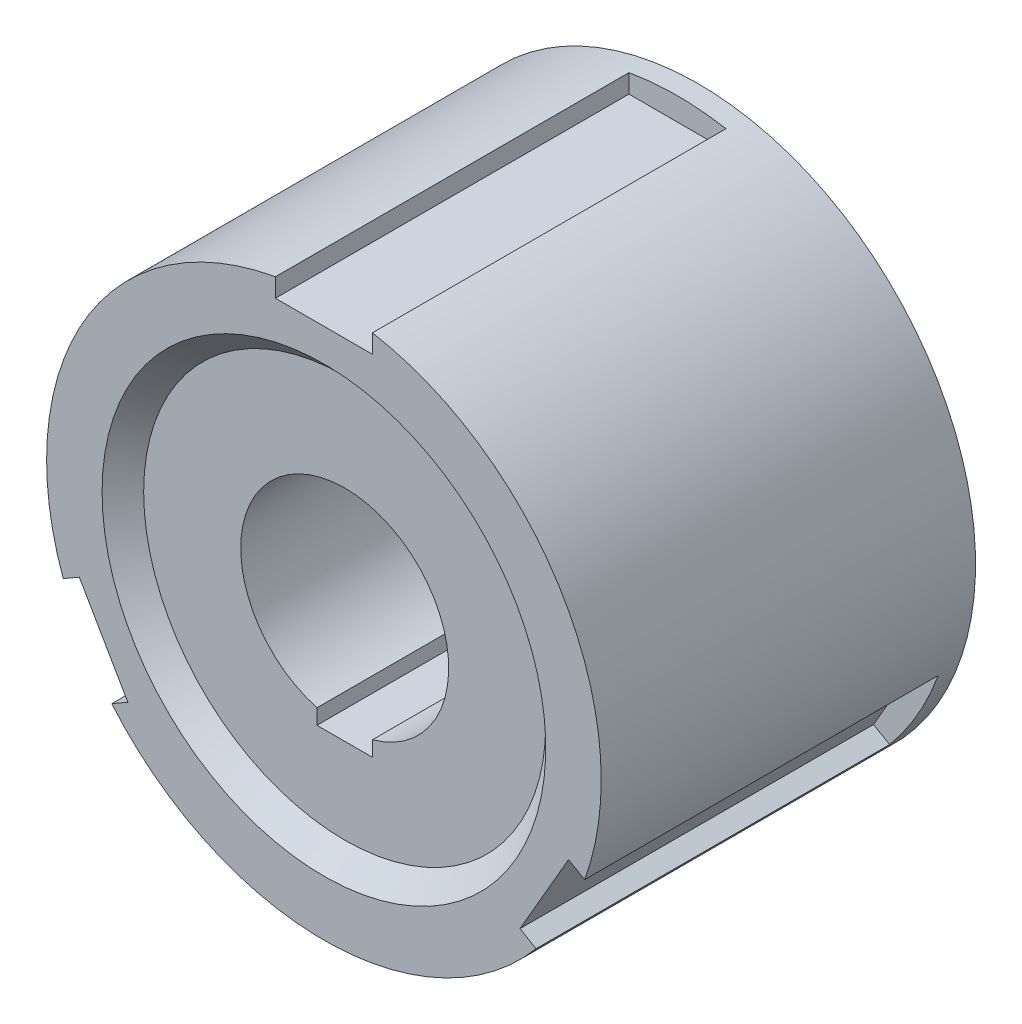
ISO-10303-21;
HEADER;
FILE_DESCRIPTION(('STEP AP214'),'2;1');
FILE_NAME('part.step','',(''),(''),'','','');
FILE_SCHEMA(('AUTOMOTIVE_DESIGN { 1 0 10303 214 1 1 1 1 }'));
ENDSEC;
DATA;
#1=APPLICATION_CONTEXT('core data for automotive mechanical design processes');
#2=APPLICATION_PROTOCOL_DEFINITION('international standard','automotive_design',2000,#1);
#3=PRODUCT_CONTEXT('',#1,'mechanical');
#4=PRODUCT('Part','Part','',(#3));
#5=PRODUCT_RELATED_PRODUCT_CATEGORY('part','',(#4));
#6=PRODUCT_DEFINITION_FORMATION('','',#4);
#7=PRODUCT_DEFINITION_CONTEXT('part definition',#1,'design');
#8=PRODUCT_DEFINITION('design','',#6,#7);
#9=PRODUCT_DEFINITION_SHAPE('','',#8);
#10=(LENGTH_UNIT() NAMED_UNIT(*) SI_UNIT(.MILLI.,.METRE.));
#11=(NAMED_UNIT(*) PLANE_ANGLE_UNIT() SI_UNIT($,.RADIAN.));
#12=(NAMED_UNIT(*) SI_UNIT($,.STERADIAN.) SOLID_ANGLE_UNIT());
#13=UNCERTAINTY_MEASURE_WITH_UNIT(LENGTH_MEASURE(1.E-05),#10,'distance_accuracy_value','');
#14=(GEOMETRIC_REPRESENTATION_CONTEXT(3) GLOBAL_UNCERTAINTY_ASSIGNED_CONTEXT((#13)) GLOBAL_UNIT_ASSIGNED_CONTEXT((#10,
#11,#12)) REPRESENTATION_CONTEXT('',''));
#15=CARTESIAN_POINT('',(0.,0.,0.));
#16=DIRECTION('',(0.,0.,1.));
#17=DIRECTION('',(1.,0.,0.));
#18=AXIS2_PLACEMENT_3D('',#15,#16,#17);
#19=CARTESIAN_POINT('',(0.,0.,58.));
#20=DIRECTION('',(0.,0.,-1.));
#21=DIRECTION('',(-1.,0.,0.));
#22=AXIS2_PLACEMENT_3D('',#19,#20,#21);
#23=CYLINDRICAL_SURFACE('',#22,40.);
#24=DIRECTION('',(0.,0.,-1.));
#25=VECTOR('',#24,1.);
#26=CARTESIAN_POINT('',(30.6064510027065,-25.7535464940059,58.));
#27=LINE('',#26,#25);
#28=CARTESIAN_POINT('',(30.6064510027065,-25.7535464940059,58.));
#29=VERTEX_POINT('',#28);
#30=CARTESIAN_POINT('',(30.6064510027065,-25.7535464940059,7.00000000000001));
#31=VERTEX_POINT('',#30);
#32=EDGE_CURVE('E50',#29,#31,#27,.T.);
#33=ORIENTED_EDGE('',*,*,#32,.F.);
#34=CARTESIAN_POINT('',(0.,0.,58.));
#35=DIRECTION('',(0.,0.,1.));
#36=DIRECTION('',(1.,0.,0.));
#37=AXIS2_PLACEMENT_3D('',#34,#35,#36);
#38=CIRCLE('',#37,40.);
#39=CARTESIAN_POINT('',(-30.6064510027061,-25.7535464940065,58.));
#40=VERTEX_POINT('',#39);
#41=EDGE_CURVE('E190',#40,#29,#38,.T.);
#42=ORIENTED_EDGE('',*,*,#41,.F.);
#43=DIRECTION('',(0.,0.,-1.));
#44=VECTOR('',#43,1.);
#45=CARTESIAN_POINT('',(-30.6064510027061,-25.7535464940065,58.));
#46=LINE('',#45,#44);
#47=CARTESIAN_POINT('',(-30.6064510027061,-25.7535464940065,7.00000000000001));
#48=VERTEX_POINT('',#47);
#49=EDGE_CURVE('E213',#40,#48,#46,.T.);
#50=ORIENTED_EDGE('',*,*,#49,.T.);
#51=CARTESIAN_POINT('',(0.,0.,7.00000000000001));
#52=DIRECTION('',(0.,0.,1.));
#53=DIRECTION('',(1.,0.,0.));
#54=AXIS2_PLACEMENT_3D('',#51,#52,#53);
#55=CIRCLE('',#54,40.);
#56=CARTESIAN_POINT('',(-37.6064510027061,-13.6291908410244,7.00000000000001));
#57=VERTEX_POINT('',#56);
#58=EDGE_CURVE('E210',#57,#48,#55,.T.);
#59=ORIENTED_EDGE('',*,*,#58,.F.);
#60=DIRECTION('',(0.,0.,-1.));
#61=VECTOR('',#60,1.);
#62=CARTESIAN_POINT('',(-37.6064510027061,-13.6291908410244,58.));
#63=LINE('',#62,#61);
#64=CARTESIAN_POINT('',(-37.6064510027061,-13.6291908410244,58.));
#65=VERTEX_POINT('',#64);
#66=EDGE_CURVE('E217',#65,#57,#63,.T.);
#67=ORIENTED_EDGE('',*,*,#66,.F.);
#68=CARTESIAN_POINT('',(-7.,39.3827373350304,58.));
#69=VERTEX_POINT('',#68);
#70=EDGE_CURVE('E191',#69,#65,#38,.T.);
#71=ORIENTED_EDGE('',*,*,#70,.F.);
#72=DIRECTION('',(0.,0.,-1.));
#73=VECTOR('',#72,1.);
#74=CARTESIAN_POINT('',(-7.,39.3827373350304,58.));
#75=LINE('',#74,#73);
#76=CARTESIAN_POINT('',(-7.,39.3827373350304,7.00000000000001));
#77=VERTEX_POINT('',#76);
#78=EDGE_CURVE('E202',#69,#77,#75,.T.);
#79=ORIENTED_EDGE('',*,*,#78,.T.);
#80=CARTESIAN_POINT('',(0.,0.,7.00000000000001));
#81=DIRECTION('',(0.,0.,1.));
#82=DIRECTION('',(1.,0.,0.));
#83=AXIS2_PLACEMENT_3D('',#80,#81,#82);
#84=CIRCLE('',#83,40.);
#85=CARTESIAN_POINT('',(7.,39.3827373350304,7.00000000000001));
#86=VERTEX_POINT('',#85);
#87=EDGE_CURVE('E199',#86,#77,#84,.T.);
#88=ORIENTED_EDGE('',*,*,#87,.F.);
#89=DIRECTION('',(0.,0.,-1.));
#90=VECTOR('',#89,1.);
#91=CARTESIAN_POINT('',(7.,39.3827373350304,58.));
#92=LINE('',#91,#90);
#93=CARTESIAN_POINT('',(7.,39.3827373350304,58.));
#94=VERTEX_POINT('',#93);
#95=EDGE_CURVE('E206',#94,#86,#92,.T.);
#96=ORIENTED_EDGE('',*,*,#95,.F.);
#97=CARTESIAN_POINT('',(37.6064510027064,-13.6291908410237,58.));
#98=VERTEX_POINT('',#97);
#99=EDGE_CURVE('E186',#98,#94,#38,.T.);
#100=ORIENTED_EDGE('',*,*,#99,.F.);
#101=DIRECTION('',(0.,0.,-1.));
#102=VECTOR('',#101,1.);
#103=CARTESIAN_POINT('',(37.6064510027064,-13.6291908410237,58.));
#104=LINE('',#103,#102);
#105=CARTESIAN_POINT('',(37.6064510027064,-13.6291908410237,7.00000000000001));
#106=VERTEX_POINT('',#105);
#107=EDGE_CURVE('E224',#98,#106,#104,.T.);
#108=ORIENTED_EDGE('',*,*,#107,.T.);
#109=CARTESIAN_POINT('',(0.,0.,7.00000000000001));
#110=DIRECTION('',(0.,0.,1.));
#111=DIRECTION('',(1.,0.,0.));
#112=AXIS2_PLACEMENT_3D('',#109,#110,#111);
#113=CIRCLE('',#112,40.);
#114=EDGE_CURVE('E221',#31,#106,#113,.T.);
#115=ORIENTED_EDGE('',*,*,#114,.F.);
#116=EDGE_LOOP('',(#33,#42,#50,#59,#67,#71,#79,#88,#96,#100,#108,#115));
#117=FACE_BOUND('',#116,.T.);
#118=CARTESIAN_POINT('',(0.,0.,4.));
#119=DIRECTION('',(0.,0.,-1.));
#120=DIRECTION('',(-1.,0.,0.));
#121=AXIS2_PLACEMENT_3D('',#118,#119,#120);
#122=CIRCLE('',#121,40.);
#123=CARTESIAN_POINT('',(-40.,0.,4.));
#124=VERTEX_POINT('',#123);
#125=EDGE_CURVE('E321',#124,#124,#122,.T.);
#126=ORIENTED_EDGE('',*,*,#125,.F.);
#127=EDGE_LOOP('',(#126));
#128=FACE_BOUND('',#127,.T.);
#129=ADVANCED_FACE('F41',(#117,#128),#23,.T.);
#130=CARTESIAN_POINT('',(0.,0.,0.));
#131=DIRECTION('',(0.,0.,1.));
#132=DIRECTION('',(1.,0.,0.));
#133=AXIS2_PLACEMENT_3D('',#130,#131,#132);
#134=PLANE('',#133);
#135=DIRECTION('',(0.,-1.,0.));
#136=VECTOR('',#135,1.);
#137=CARTESIAN_POINT('',(4.,0.,0.));
#138=LINE('',#137,#136);
#139=CARTESIAN_POINT('',(4.,-14.456832294801,0.));
#140=VERTEX_POINT('',#139);
#141=CARTESIAN_POINT('',(4.,-16.65,0.));
#142=VERTEX_POINT('',#141);
#143=EDGE_CURVE('E196',#140,#142,#138,.T.);
#144=ORIENTED_EDGE('',*,*,#143,.F.);
#145=CARTESIAN_POINT('',(0.,0.,0.));
#146=DIRECTION('',(0.,0.,1.));
#147=DIRECTION('',(1.,0.,0.));
#148=AXIS2_PLACEMENT_3D('',#145,#146,#147);
#149=CIRCLE('',#148,15.);
#150=CARTESIAN_POINT('',(-4.,-14.456832294801,0.));
#151=VERTEX_POINT('',#150);
#152=EDGE_CURVE('E179',#140,#151,#149,.T.);
#153=ORIENTED_EDGE('',*,*,#152,.T.);
#154=DIRECTION('',(0.,-1.,0.));
#155=VECTOR('',#154,1.);
#156=CARTESIAN_POINT('',(-4.00000000000001,0.,0.));
#157=LINE('',#156,#155);
#158=CARTESIAN_POINT('',(-4.,-16.65,0.));
#159=VERTEX_POINT('',#158);
#160=EDGE_CURVE('E173',#151,#159,#157,.T.);
#161=ORIENTED_EDGE('',*,*,#160,.T.);
#162=DIRECTION('',(1.,0.,0.));
#163=VECTOR('',#162,1.);
#164=CARTESIAN_POINT('',(-4.,-16.65,0.));
#165=LINE('',#164,#163);
#166=EDGE_CURVE('E272',#159,#142,#165,.T.);
#167=ORIENTED_EDGE('',*,*,#166,.T.);
#168=EDGE_LOOP('',(#144,#153,#161,#167));
#169=FACE_BOUND('',#168,.T.);
#170=CARTESIAN_POINT('',(0.,0.,0.));
#171=DIRECTION('',(0.,0.,-1.));
#172=DIRECTION('',(-1.,0.,0.));
#173=AXIS2_PLACEMENT_3D('',#170,#171,#172);
#174=CIRCLE('',#173,33.);
#175=CARTESIAN_POINT('',(-33.,0.,0.));
#176=VERTEX_POINT('',#175);
#177=EDGE_CURVE('E168',#176,#176,#174,.T.);
#178=ORIENTED_EDGE('',*,*,#177,.T.);
#179=EDGE_LOOP('',(#178));
#180=FACE_BOUND('',#179,.T.);
#181=ADVANCED_FACE('F340',(#169,#180),#134,.F.);
#182=CARTESIAN_POINT('',(0.,0.,58.));
#183=DIRECTION('',(0.,0.,1.));
#184=DIRECTION('',(1.,0.,0.));
#185=AXIS2_PLACEMENT_3D('',#182,#183,#184);
#186=PLANE('',#185);
#187=CARTESIAN_POINT('',(0.,0.,58.));
#188=DIRECTION('',(0.,0.,-1.));
#189=DIRECTION('',(-1.,0.,0.));
#190=AXIS2_PLACEMENT_3D('',#187,#188,#189);
#191=CIRCLE('',#190,32.);
#192=CARTESIAN_POINT('',(-32.,0.,58.));
#193=VERTEX_POINT('',#192);
#194=EDGE_CURVE('E347',#193,#193,#191,.T.);
#195=ORIENTED_EDGE('',*,*,#194,.T.);
#196=EDGE_LOOP('',(#195));
#197=FACE_BOUND('',#196,.T.);
#198=ORIENTED_EDGE('',*,*,#41,.T.);
#199=DIRECTION('',(-0.866025403784444,0.499999999999992,0.));
#200=VECTOR('',#199,1.);
#201=CARTESIAN_POINT('',(-3.49999999999991,-6.06217782649105,58.));
#202=LINE('',#201,#200);
#203=CARTESIAN_POINT('',(28.2825798098105,-24.4118588352254,58.));
#204=VERTEX_POINT('',#203);
#205=EDGE_CURVE('E234',#29,#204,#202,.T.);
#206=ORIENTED_EDGE('',*,*,#205,.T.);
#207=DIRECTION('',(0.499999999999991,0.866025403784444,0.));
#208=VECTOR('',#207,1.);
#209=CARTESIAN_POINT('',(31.7825798098104,-18.3496810087344,58.));
#210=LINE('',#209,#208);
#211=CARTESIAN_POINT('',(35.2825798098103,-12.2875031822432,58.));
#212=VERTEX_POINT('',#211);
#213=EDGE_CURVE('E256',#204,#212,#210,.T.);
#214=ORIENTED_EDGE('',*,*,#213,.T.);
#215=DIRECTION('',(-0.866025403784444,0.49999999999999,0.));
#216=VECTOR('',#215,1.);
#217=CARTESIAN_POINT('',(3.49999999999994,6.06217782649112,58.));
#218=LINE('',#217,#216);
#219=EDGE_CURVE('E262',#98,#212,#218,.T.);
#220=ORIENTED_EDGE('',*,*,#219,.F.);
#221=ORIENTED_EDGE('',*,*,#99,.T.);
#222=DIRECTION('',(0.,-1.,0.));
#223=VECTOR('',#222,1.);
#224=CARTESIAN_POINT('',(7.,0.,58.));
#225=LINE('',#224,#223);
#226=CARTESIAN_POINT('',(7.,36.6993620174694,58.));
#227=VERTEX_POINT('',#226);
#228=EDGE_CURVE('E316',#94,#227,#225,.T.);
#229=ORIENTED_EDGE('',*,*,#228,.T.);
#230=DIRECTION('',(1.,0.,0.));
#231=VECTOR('',#230,1.);
#232=CARTESIAN_POINT('',(0.,36.6993620174694,58.));
#233=LINE('',#232,#231);
#234=CARTESIAN_POINT('',(-7.,36.6993620174694,58.));
#235=VERTEX_POINT('',#234);
#236=EDGE_CURVE('E308',#235,#227,#233,.T.);
#237=ORIENTED_EDGE('',*,*,#236,.F.);
#238=DIRECTION('',(0.,-1.,0.));
#239=VECTOR('',#238,1.);
#240=CARTESIAN_POINT('',(-7.,0.,58.));
#241=LINE('',#240,#239);
#242=EDGE_CURVE('E320',#69,#235,#241,.T.);
#243=ORIENTED_EDGE('',*,*,#242,.F.);
#244=ORIENTED_EDGE('',*,*,#70,.T.);
#245=DIRECTION('',(0.866025403784436,0.500000000000005,0.));
#246=VECTOR('',#245,1.);
#247=CARTESIAN_POINT('',(-3.50000000000004,6.06217782649105,58.));
#248=LINE('',#247,#246);
#249=CARTESIAN_POINT('',(-35.2825798098101,-12.2875031822438,58.));
#250=VERTEX_POINT('',#249);
#251=EDGE_CURVE('E287',#65,#250,#248,.T.);
#252=ORIENTED_EDGE('',*,*,#251,.T.);
#253=DIRECTION('',(0.500000000000005,-0.866025403784436,0.));
#254=VECTOR('',#253,1.);
#255=CARTESIAN_POINT('',(-31.7825798098101,-18.3496810087348,58.));
#256=LINE('',#255,#254);
#257=CARTESIAN_POINT('',(-28.28257980981,-24.4118588352259,58.));
#258=VERTEX_POINT('',#257);
#259=EDGE_CURVE('E279',#250,#258,#256,.T.);
#260=ORIENTED_EDGE('',*,*,#259,.T.);
#261=DIRECTION('',(0.866025403784436,0.500000000000005,0.));
#262=VECTOR('',#261,1.);
#263=CARTESIAN_POINT('',(3.50000000000004,-6.06217782649107,58.));
#264=LINE('',#263,#262);
#265=EDGE_CURVE('E291',#40,#258,#264,.T.);
#266=ORIENTED_EDGE('',*,*,#265,.F.);
#267=EDGE_LOOP('',(#198,#206,#214,#220,#221,#229,#237,#243,#244,#252,#260,#266));
#268=FACE_BOUND('',#267,.T.);
#269=ADVANCED_FACE('F366',(#197,#268),#186,.T.);
#270=CARTESIAN_POINT('',(0.,0.,58.));
#271=DIRECTION('',(0.,0.,-1.));
#272=DIRECTION('',(-1.,0.,0.));
#273=AXIS2_PLACEMENT_3D('',#270,#271,#272);
#274=CYLINDRICAL_SURFACE('',#273,15.);
#275=CARTESIAN_POINT('',(0.,0.,55.));
#276=DIRECTION('',(0.,0.,-1.));
#277=DIRECTION('',(-1.,0.,0.));
#278=AXIS2_PLACEMENT_3D('',#275,#276,#277);
#279=CIRCLE('',#278,15.);
#280=CARTESIAN_POINT('',(-4.,-14.456832294801,55.));
#281=VERTEX_POINT('',#280);
#282=CARTESIAN_POINT('',(4.,-14.456832294801,55.));
#283=VERTEX_POINT('',#282);
#284=EDGE_CURVE('E154',#281,#283,#279,.T.);
#285=ORIENTED_EDGE('',*,*,#284,.F.);
#286=DIRECTION('',(0.,0.,-1.));
#287=VECTOR('',#286,1.);
#288=CARTESIAN_POINT('',(-4.,-14.456832294801,58.));
#289=LINE('',#288,#287);
#290=EDGE_CURVE('E164',#151,#281,#289,.F.);
#291=ORIENTED_EDGE('',*,*,#290,.F.);
#292=ORIENTED_EDGE('',*,*,#152,.F.);
#293=DIRECTION('',(0.,0.,-1.));
#294=VECTOR('',#293,1.);
#295=CARTESIAN_POINT('',(4.,-14.456832294801,58.));
#296=LINE('',#295,#294);
#297=EDGE_CURVE('E166',#140,#283,#296,.F.);
#298=ORIENTED_EDGE('',*,*,#297,.T.);
#299=EDGE_LOOP('',(#285,#291,#292,#298));
#300=FACE_BOUND('',#299,.T.);
#301=ADVANCED_FACE('F43',(#300),#274,.F.);
#302=CARTESIAN_POINT('',(4.,-13.35,0.));
#303=DIRECTION('',(-1.,0.,0.));
#304=DIRECTION('',(0.,-1.,0.));
#305=AXIS2_PLACEMENT_3D('',#302,#303,#304);
#306=PLANE('',#305);
#307=DIRECTION('',(0.,-1.,0.));
#308=VECTOR('',#307,1.);
#309=CARTESIAN_POINT('',(4.,-13.35,55.));
#310=LINE('',#309,#308);
#311=CARTESIAN_POINT('',(4.,-16.65,55.));
#312=VERTEX_POINT('',#311);
#313=EDGE_CURVE('E169',#283,#312,#310,.T.);
#314=ORIENTED_EDGE('',*,*,#313,.F.);
#315=ORIENTED_EDGE('',*,*,#297,.F.);
#316=ORIENTED_EDGE('',*,*,#143,.T.);
#317=DIRECTION('',(0.,0.,1.));
#318=VECTOR('',#317,1.);
#319=CARTESIAN_POINT('',(4.,-16.65,0.));
#320=LINE('',#319,#318);
#321=EDGE_CURVE('E175',#142,#312,#320,.T.);
#322=ORIENTED_EDGE('',*,*,#321,.T.);
#323=EDGE_LOOP('',(#314,#315,#316,#322));
#324=FACE_BOUND('',#323,.T.);
#325=ADVANCED_FACE('F343',(#324),#306,.T.);
#326=CARTESIAN_POINT('',(-4.,-16.65,0.));
#327=DIRECTION('',(0.,-1.,0.));
#328=DIRECTION('',(0.,0.,-1.));
#329=AXIS2_PLACEMENT_3D('',#326,#327,#328);
#330=PLANE('',#329);
#331=DIRECTION('',(0.,0.,1.));
#332=VECTOR('',#331,1.);
#333=CARTESIAN_POINT('',(-4.,-16.65,0.));
#334=LINE('',#333,#332);
#335=CARTESIAN_POINT('',(-4.,-16.65,55.));
#336=VERTEX_POINT('',#335);
#337=EDGE_CURVE('E182',#159,#336,#334,.T.);
#338=ORIENTED_EDGE('',*,*,#337,.T.);
#339=DIRECTION('',(1.,0.,0.));
#340=VECTOR('',#339,1.);
#341=CARTESIAN_POINT('',(-4.,-16.65,55.));
#342=LINE('',#341,#340);
#343=EDGE_CURVE('E57',#336,#312,#342,.T.);
#344=ORIENTED_EDGE('',*,*,#343,.T.);
#345=ORIENTED_EDGE('',*,*,#321,.F.);
#346=ORIENTED_EDGE('',*,*,#166,.F.);
#347=EDGE_LOOP('',(#338,#344,#345,#346));
#348=FACE_BOUND('',#347,.T.);
#349=ADVANCED_FACE('F336',(#348),#330,.F.);
#350=CARTESIAN_POINT('',(-4.,-13.35,0.));
#351=DIRECTION('',(-1.,0.,0.));
#352=DIRECTION('',(0.,-1.,0.));
#353=AXIS2_PLACEMENT_3D('',#350,#351,#352);
#354=PLANE('',#353);
#355=ORIENTED_EDGE('',*,*,#290,.T.);
#356=DIRECTION('',(0.,-1.,0.));
#357=VECTOR('',#356,1.);
#358=CARTESIAN_POINT('',(-4.,-13.35,55.));
#359=LINE('',#358,#357);
#360=EDGE_CURVE('E11',#281,#336,#359,.T.);
#361=ORIENTED_EDGE('',*,*,#360,.T.);
#362=ORIENTED_EDGE('',*,*,#337,.F.);
#363=ORIENTED_EDGE('',*,*,#160,.F.);
#364=EDGE_LOOP('',(#355,#361,#362,#363));
#365=FACE_BOUND('',#364,.T.);
#366=ADVANCED_FACE('F171',(#365),#354,.F.);
#367=CARTESIAN_POINT('',(7.,0.,7.00000000000001));
#368=DIRECTION('',(-1.,0.,0.));
#369=DIRECTION('',(0.,-1.,0.));
#370=AXIS2_PLACEMENT_3D('',#367,#368,#369);
#371=PLANE('',#370);
#372=ORIENTED_EDGE('',*,*,#95,.T.);
#373=DIRECTION('',(0.,-1.,0.));
#374=VECTOR('',#373,1.);
#375=CARTESIAN_POINT('',(7.,0.,7.00000000000001));
#376=LINE('',#375,#374);
#377=CARTESIAN_POINT('',(7.,36.6993620174694,7.00000000000001));
#378=VERTEX_POINT('',#377);
#379=EDGE_CURVE('E304',#86,#378,#376,.T.);
#380=ORIENTED_EDGE('',*,*,#379,.T.);
#381=DIRECTION('',(0.,0.,1.));
#382=VECTOR('',#381,1.);
#383=CARTESIAN_POINT('',(7.,36.6993620174694,7.00000000000001));
#384=LINE('',#383,#382);
#385=EDGE_CURVE('E292',#378,#227,#384,.T.);
#386=ORIENTED_EDGE('',*,*,#385,.T.);
#387=ORIENTED_EDGE('',*,*,#228,.F.);
#388=EDGE_LOOP('',(#372,#380,#386,#387));
#389=FACE_BOUND('',#388,.T.);
#390=ADVANCED_FACE('F378',(#389),#371,.T.);
#391=CARTESIAN_POINT('',(-7.,0.,7.00000000000001));
#392=DIRECTION('',(-1.,0.,0.));
#393=DIRECTION('',(0.,-1.,0.));
#394=AXIS2_PLACEMENT_3D('',#391,#392,#393);
#395=PLANE('',#394);
#396=ORIENTED_EDGE('',*,*,#242,.T.);
#397=DIRECTION('',(0.,0.,1.));
#398=VECTOR('',#397,1.);
#399=CARTESIAN_POINT('',(-7.,36.6993620174694,7.00000000000001));
#400=LINE('',#399,#398);
#401=CARTESIAN_POINT('',(-7.,36.6993620174694,7.00000000000001));
#402=VERTEX_POINT('',#401);
#403=EDGE_CURVE('E315',#402,#235,#400,.T.);
#404=ORIENTED_EDGE('',*,*,#403,.F.);
#405=DIRECTION('',(0.,-1.,0.));
#406=VECTOR('',#405,1.);
#407=CARTESIAN_POINT('',(-7.,0.,7.00000000000001));
#408=LINE('',#407,#406);
#409=EDGE_CURVE('E307',#77,#402,#408,.T.);
#410=ORIENTED_EDGE('',*,*,#409,.F.);
#411=ORIENTED_EDGE('',*,*,#78,.F.);
#412=EDGE_LOOP('',(#396,#404,#410,#411));
#413=FACE_BOUND('',#412,.T.);
#414=ADVANCED_FACE('F381',(#413),#395,.F.);
#415=CARTESIAN_POINT('',(0.,0.,7.00000000000001));
#416=DIRECTION('',(0.,0.,1.));
#417=DIRECTION('',(1.,0.,0.));
#418=AXIS2_PLACEMENT_3D('',#415,#416,#417);
#419=PLANE('',#418);
#420=ORIENTED_EDGE('',*,*,#87,.T.);
#421=ORIENTED_EDGE('',*,*,#409,.T.);
#422=DIRECTION('',(1.,0.,0.));
#423=VECTOR('',#422,1.);
#424=CARTESIAN_POINT('',(0.,36.6993620174694,7.00000000000001));
#425=LINE('',#424,#423);
#426=EDGE_CURVE('E311',#402,#378,#425,.T.);
#427=ORIENTED_EDGE('',*,*,#426,.T.);
#428=ORIENTED_EDGE('',*,*,#379,.F.);
#429=EDGE_LOOP('',(#420,#421,#427,#428));
#430=FACE_BOUND('',#429,.T.);
#431=ADVANCED_FACE('F385',(#430),#419,.T.);
#432=CARTESIAN_POINT('',(0.,36.6993620174694,7.00000000000001));
#433=DIRECTION('',(0.,-1.,0.));
#434=DIRECTION('',(0.,0.,-1.));
#435=AXIS2_PLACEMENT_3D('',#432,#433,#434);
#436=PLANE('',#435);
#437=ORIENTED_EDGE('',*,*,#236,.T.);
#438=ORIENTED_EDGE('',*,*,#385,.F.);
#439=ORIENTED_EDGE('',*,*,#426,.F.);
#440=ORIENTED_EDGE('',*,*,#403,.T.);
#441=EDGE_LOOP('',(#437,#438,#439,#440));
#442=FACE_BOUND('',#441,.T.);
#443=ADVANCED_FACE('F387',(#442),#436,.F.);
#444=CARTESIAN_POINT('',(-3.50000000000004,6.06217782649105,7.00000000000001));
#445=DIRECTION('',(0.500000000000005,-0.866025403784436,0.));
#446=DIRECTION('',(0.866025403784436,0.500000000000005,0.));
#447=AXIS2_PLACEMENT_3D('',#444,#445,#446);
#448=PLANE('',#447);
#449=ORIENTED_EDGE('',*,*,#66,.T.);
#450=DIRECTION('',(0.866025403784436,0.500000000000005,0.));
#451=VECTOR('',#450,1.);
#452=CARTESIAN_POINT('',(-3.50000000000004,6.06217782649105,7.00000000000001));
#453=LINE('',#452,#451);
#454=CARTESIAN_POINT('',(-35.2825798098101,-12.2875031822438,7.00000000000001));
#455=VERTEX_POINT('',#454);
#456=EDGE_CURVE('E275',#57,#455,#453,.T.);
#457=ORIENTED_EDGE('',*,*,#456,.T.);
#458=DIRECTION('',(0.,0.,1.));
#459=VECTOR('',#458,1.);
#460=CARTESIAN_POINT('',(-35.2825798098101,-12.2875031822438,7.00000000000001));
#461=LINE('',#460,#459);
#462=EDGE_CURVE('E263',#455,#250,#461,.T.);
#463=ORIENTED_EDGE('',*,*,#462,.T.);
#464=ORIENTED_EDGE('',*,*,#251,.F.);
#465=EDGE_LOOP('',(#449,#457,#463,#464));
#466=FACE_BOUND('',#465,.T.);
#467=ADVANCED_FACE('F390',(#466),#448,.T.);
#468=CARTESIAN_POINT('',(3.50000000000004,-6.06217782649107,7.00000000000001));
#469=DIRECTION('',(0.500000000000005,-0.866025403784436,0.));
#470=DIRECTION('',(0.866025403784436,0.500000000000005,0.));
#471=AXIS2_PLACEMENT_3D('',#468,#469,#470);
#472=PLANE('',#471);
#473=ORIENTED_EDGE('',*,*,#265,.T.);
#474=DIRECTION('',(0.,0.,1.));
#475=VECTOR('',#474,1.);
#476=CARTESIAN_POINT('',(-28.28257980981,-24.4118588352259,7.00000000000001));
#477=LINE('',#476,#475);
#478=CARTESIAN_POINT('',(-28.28257980981,-24.4118588352259,7.00000000000001));
#479=VERTEX_POINT('',#478);
#480=EDGE_CURVE('E286',#479,#258,#477,.T.);
#481=ORIENTED_EDGE('',*,*,#480,.F.);
#482=DIRECTION('',(0.866025403784436,0.500000000000005,0.));
#483=VECTOR('',#482,1.);
#484=CARTESIAN_POINT('',(3.50000000000004,-6.06217782649107,7.00000000000001));
#485=LINE('',#484,#483);
#486=EDGE_CURVE('E278',#48,#479,#485,.T.);
#487=ORIENTED_EDGE('',*,*,#486,.F.);
#488=ORIENTED_EDGE('',*,*,#49,.F.);
#489=EDGE_LOOP('',(#473,#481,#487,#488));
#490=FACE_BOUND('',#489,.T.);
#491=ADVANCED_FACE('F397',(#490),#472,.F.);
#492=CARTESIAN_POINT('',(0.,0.,7.00000000000001));
#493=DIRECTION('',(0.,0.,1.));
#494=DIRECTION('',(1.,0.,0.));
#495=AXIS2_PLACEMENT_3D('',#492,#493,#494);
#496=PLANE('',#495);
#497=ORIENTED_EDGE('',*,*,#58,.T.);
#498=ORIENTED_EDGE('',*,*,#486,.T.);
#499=DIRECTION('',(0.500000000000005,-0.866025403784436,0.));
#500=VECTOR('',#499,1.);
#501=CARTESIAN_POINT('',(-31.7825798098101,-18.3496810087348,7.00000000000001));
#502=LINE('',#501,#500);
#503=EDGE_CURVE('E282',#455,#479,#502,.T.);
#504=ORIENTED_EDGE('',*,*,#503,.F.);
#505=ORIENTED_EDGE('',*,*,#456,.F.);
#506=EDGE_LOOP('',(#497,#498,#504,#505));
#507=FACE_BOUND('',#506,.T.);
#508=ADVANCED_FACE('F401',(#507),#496,.T.);
#509=CARTESIAN_POINT('',(-31.7825798098101,-18.3496810087348,7.00000000000001));
#510=DIRECTION('',(-0.866025403784436,-0.500000000000004,0.));
#511=DIRECTION('',(0.500000000000005,-0.866025403784436,0.));
#512=AXIS2_PLACEMENT_3D('',#509,#510,#511);
#513=PLANE('',#512);
#514=ORIENTED_EDGE('',*,*,#259,.F.);
#515=ORIENTED_EDGE('',*,*,#462,.F.);
#516=ORIENTED_EDGE('',*,*,#503,.T.);
#517=ORIENTED_EDGE('',*,*,#480,.T.);
#518=EDGE_LOOP('',(#514,#515,#516,#517));
#519=FACE_BOUND('',#518,.T.);
#520=ADVANCED_FACE('F403',(#519),#513,.T.);
#521=CARTESIAN_POINT('',(-3.49999999999991,-6.06217782649105,7.00000000000001));
#522=DIRECTION('',(0.499999999999992,0.866025403784443,0.));
#523=DIRECTION('',(-0.866025403784444,0.499999999999992,0.));
#524=AXIS2_PLACEMENT_3D('',#521,#522,#523);
#525=PLANE('',#524);
#526=ORIENTED_EDGE('',*,*,#32,.T.);
#527=DIRECTION('',(-0.866025403784444,0.499999999999992,0.));
#528=VECTOR('',#527,1.);
#529=CARTESIAN_POINT('',(-3.49999999999991,-6.06217782649105,7.00000000000001));
#530=LINE('',#529,#528);
#531=CARTESIAN_POINT('',(28.2825798098105,-24.4118588352254,7.00000000000001));
#532=VERTEX_POINT('',#531);
#533=EDGE_CURVE('E64',#31,#532,#530,.T.);
#534=ORIENTED_EDGE('',*,*,#533,.T.);
#535=DIRECTION('',(0.,0.,1.));
#536=VECTOR('',#535,1.);
#537=CARTESIAN_POINT('',(28.2825798098105,-24.4118588352254,7.00000000000001));
#538=LINE('',#537,#536);
#539=EDGE_CURVE('E269',#532,#204,#538,.T.);
#540=ORIENTED_EDGE('',*,*,#539,.T.);
#541=ORIENTED_EDGE('',*,*,#205,.F.);
#542=EDGE_LOOP('',(#526,#534,#540,#541));
#543=FACE_BOUND('',#542,.T.);
#544=ADVANCED_FACE('F231',(#543),#525,.T.);
#545=CARTESIAN_POINT('',(3.49999999999994,6.06217782649112,7.00000000000001));
#546=DIRECTION('',(0.49999999999999,0.866025403784444,0.));
#547=DIRECTION('',(-0.866025403784444,0.49999999999999,0.));
#548=AXIS2_PLACEMENT_3D('',#545,#546,#547);
#549=PLANE('',#548);
#550=ORIENTED_EDGE('',*,*,#219,.T.);
#551=DIRECTION('',(0.,0.,1.));
#552=VECTOR('',#551,1.);
#553=CARTESIAN_POINT('',(35.2825798098103,-12.2875031822432,7.00000000000001));
#554=LINE('',#553,#552);
#555=CARTESIAN_POINT('',(35.2825798098103,-12.2875031822432,7.00000000000001));
#556=VERTEX_POINT('',#555);
#557=EDGE_CURVE('E249',#556,#212,#554,.T.);
#558=ORIENTED_EDGE('',*,*,#557,.F.);
#559=DIRECTION('',(-0.866025403784444,0.49999999999999,0.));
#560=VECTOR('',#559,1.);
#561=CARTESIAN_POINT('',(3.49999999999994,6.06217782649112,7.00000000000001));
#562=LINE('',#561,#560);
#563=EDGE_CURVE('E242',#106,#556,#562,.T.);
#564=ORIENTED_EDGE('',*,*,#563,.F.);
#565=ORIENTED_EDGE('',*,*,#107,.F.);
#566=EDGE_LOOP('',(#550,#558,#564,#565));
#567=FACE_BOUND('',#566,.T.);
#568=ADVANCED_FACE('F246',(#567),#549,.F.);
#569=CARTESIAN_POINT('',(0.,0.,7.00000000000001));
#570=DIRECTION('',(0.,0.,1.));
#571=DIRECTION('',(1.,0.,0.));
#572=AXIS2_PLACEMENT_3D('',#569,#570,#571);
#573=PLANE('',#572);
#574=ORIENTED_EDGE('',*,*,#114,.T.);
#575=ORIENTED_EDGE('',*,*,#563,.T.);
#576=DIRECTION('',(0.499999999999991,0.866025403784444,0.));
#577=VECTOR('',#576,1.);
#578=CARTESIAN_POINT('',(31.7825798098104,-18.3496810087344,7.00000000000001));
#579=LINE('',#578,#577);
#580=EDGE_CURVE('E251',#532,#556,#579,.T.);
#581=ORIENTED_EDGE('',*,*,#580,.F.);
#582=ORIENTED_EDGE('',*,*,#533,.F.);
#583=EDGE_LOOP('',(#574,#575,#581,#582));
#584=FACE_BOUND('',#583,.T.);
#585=ADVANCED_FACE('F241',(#584),#573,.T.);
#586=CARTESIAN_POINT('',(31.7825798098104,-18.3496810087344,7.00000000000001));
#587=DIRECTION('',(0.866025403784444,-0.499999999999991,0.));
#588=DIRECTION('',(0.499999999999991,0.866025403784444,0.));
#589=AXIS2_PLACEMENT_3D('',#586,#587,#588);
#590=PLANE('',#589);
#591=ORIENTED_EDGE('',*,*,#213,.F.);
#592=ORIENTED_EDGE('',*,*,#539,.F.);
#593=ORIENTED_EDGE('',*,*,#580,.T.);
#594=ORIENTED_EDGE('',*,*,#557,.T.);
#595=EDGE_LOOP('',(#591,#592,#593,#594));
#596=FACE_BOUND('',#595,.T.);
#597=ADVANCED_FACE('F414',(#596),#590,.T.);
#598=CARTESIAN_POINT('',(0.,0.,4.));
#599=DIRECTION('',(0.,0.,-1.));
#600=DIRECTION('',(-1.,0.,0.));
#601=AXIS2_PLACEMENT_3D('',#598,#599,#600);
#602=PLANE('',#601);
#603=CARTESIAN_POINT('',(0.,0.,4.));
#604=DIRECTION('',(0.,0.,-1.));
#605=DIRECTION('',(-1.,0.,0.));
#606=AXIS2_PLACEMENT_3D('',#603,#604,#605);
#607=CIRCLE('',#606,33.);
#608=CARTESIAN_POINT('',(-33.,0.,4.));
#609=VERTEX_POINT('',#608);
#610=EDGE_CURVE('E351',#609,#609,#607,.T.);
#611=ORIENTED_EDGE('',*,*,#610,.F.);
#612=EDGE_LOOP('',(#611));
#613=FACE_BOUND('',#612,.T.);
#614=ORIENTED_EDGE('',*,*,#125,.T.);
#615=EDGE_LOOP('',(#614));
#616=FACE_BOUND('',#615,.T.);
#617=ADVANCED_FACE('F361',(#613,#616),#602,.T.);
#618=CARTESIAN_POINT('',(0.,0.,4.));
#619=DIRECTION('',(0.,0.,-1.));
#620=DIRECTION('',(-1.,0.,0.));
#621=AXIS2_PLACEMENT_3D('',#618,#619,#620);
#622=CYLINDRICAL_SURFACE('',#621,33.);
#623=ORIENTED_EDGE('',*,*,#610,.T.);
#624=EDGE_LOOP('',(#623));
#625=FACE_BOUND('',#624,.T.);
#626=ORIENTED_EDGE('',*,*,#177,.F.);
#627=EDGE_LOOP('',(#626));
#628=FACE_BOUND('',#627,.T.);
#629=ADVANCED_FACE('F422',(#625,#628),#622,.T.);
#630=CARTESIAN_POINT('',(0.,0.,55.));
#631=DIRECTION('',(0.,0.,1.));
#632=DIRECTION('',(1.,0.,0.));
#633=AXIS2_PLACEMENT_3D('',#630,#631,#632);
#634=CONICAL_SURFACE('',#633,29.,0.785398163397447);
#635=ORIENTED_EDGE('',*,*,#194,.F.);
#636=EDGE_LOOP('',(#635));
#637=FACE_BOUND('',#636,.T.);
#638=CARTESIAN_POINT('',(0.,0.,55.));
#639=DIRECTION('',(0.,0.,-1.));
#640=DIRECTION('',(-1.,0.,0.));
#641=AXIS2_PLACEMENT_3D('',#638,#639,#640);
#642=CIRCLE('',#641,29.);
#643=CARTESIAN_POINT('',(-29.,0.,55.));
#644=VERTEX_POINT('',#643);
#645=EDGE_CURVE('E589',#644,#644,#642,.T.);
#646=ORIENTED_EDGE('',*,*,#645,.T.);
#647=EDGE_LOOP('',(#646));
#648=FACE_BOUND('',#647,.T.);
#649=ADVANCED_FACE('F426',(#637,#648),#634,.F.);
#650=CARTESIAN_POINT('',(0.,29.,55.));
#651=DIRECTION('',(0.,0.,-1.));
#652=DIRECTION('',(-1.,0.,0.));
#653=AXIS2_PLACEMENT_3D('',#650,#651,#652);
#654=PLANE('',#653);
#655=ORIENTED_EDGE('',*,*,#284,.T.);
#656=ORIENTED_EDGE('',*,*,#313,.T.);
#657=ORIENTED_EDGE('',*,*,#343,.F.);
#658=ORIENTED_EDGE('',*,*,#360,.F.);
#659=EDGE_LOOP('',(#655,#656,#657,#658));
#660=FACE_BOUND('',#659,.T.);
#661=ORIENTED_EDGE('',*,*,#645,.F.);
#662=EDGE_LOOP('',(#661));
#663=FACE_BOUND('',#662,.T.);
#664=ADVANCED_FACE('F152',(#660,#663),#654,.F.);
#665=CLOSED_SHELL('',(#129,#181,#269,#301,#325,#349,#366,#390,#414,#431,#443,#467,#491,#508,
#520,#544,#568,#585,#597,#617,#629,#649,#664));
#666=MANIFOLD_SOLID_BREP('B2',#665);
#667=ADVANCED_BREP_SHAPE_REPRESENTATION('',(#18,#666),#14);
#668=SHAPE_DEFINITION_REPRESENTATION(#9,#667);
ENDSEC;
END-ISO-10303-21;
